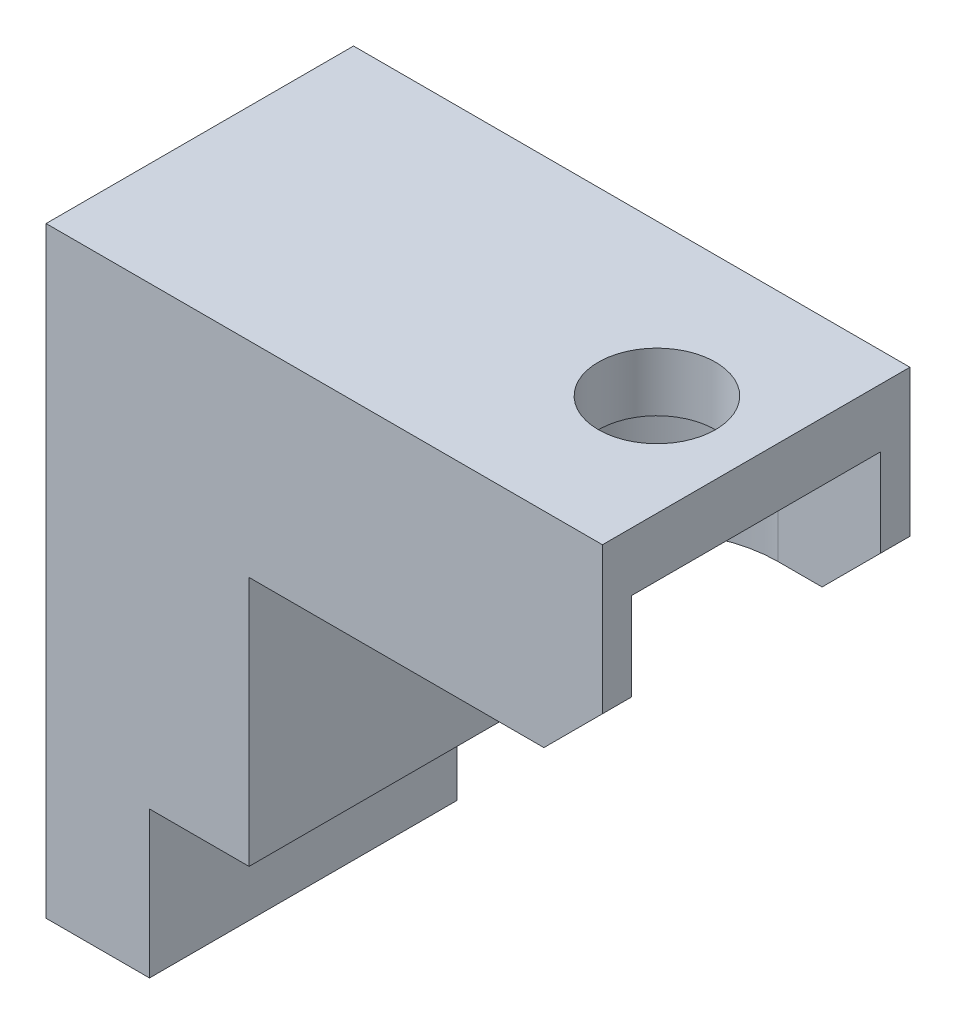
ISO-10303-21;
HEADER;
FILE_DESCRIPTION(('STEP AP214'),'2;1');
FILE_NAME('part.step','',(''),(''),'','','');
FILE_SCHEMA(('AUTOMOTIVE_DESIGN { 1 0 10303 214 1 1 1 1 }'));
ENDSEC;
DATA;
#1=APPLICATION_CONTEXT('core data for automotive mechanical design processes');
#2=APPLICATION_PROTOCOL_DEFINITION('international standard','automotive_design',2000,#1);
#3=PRODUCT_CONTEXT('',#1,'mechanical');
#4=PRODUCT('Part','Part','',(#3));
#5=PRODUCT_RELATED_PRODUCT_CATEGORY('part','',(#4));
#6=PRODUCT_DEFINITION_FORMATION('','',#4);
#7=PRODUCT_DEFINITION_CONTEXT('part definition',#1,'design');
#8=PRODUCT_DEFINITION('design','',#6,#7);
#9=PRODUCT_DEFINITION_SHAPE('','',#8);
#10=(LENGTH_UNIT() NAMED_UNIT(*) SI_UNIT(.MILLI.,.METRE.));
#11=(NAMED_UNIT(*) PLANE_ANGLE_UNIT() SI_UNIT($,.RADIAN.));
#12=(NAMED_UNIT(*) SI_UNIT($,.STERADIAN.) SOLID_ANGLE_UNIT());
#13=UNCERTAINTY_MEASURE_WITH_UNIT(LENGTH_MEASURE(1.E-05),#10,'distance_accuracy_value','');
#14=(GEOMETRIC_REPRESENTATION_CONTEXT(3) GLOBAL_UNCERTAINTY_ASSIGNED_CONTEXT((#13)) GLOBAL_UNIT_ASSIGNED_CONTEXT((#10,
#11,#12)) REPRESENTATION_CONTEXT('',''));
#15=CARTESIAN_POINT('',(0.,0.,0.));
#16=DIRECTION('',(0.,0.,1.));
#17=DIRECTION('',(1.,0.,0.));
#18=AXIS2_PLACEMENT_3D('',#15,#16,#17);
#19=CARTESIAN_POINT('',(-67.7875988190554,35.4526071642136,5.25));
#20=DIRECTION('',(-1.,0.,0.));
#21=DIRECTION('',(0.,-1.,0.));
#22=AXIS2_PLACEMENT_3D('',#19,#20,#21);
#23=PLANE('',#22);
#24=DIRECTION('',(0.,0.,-1.));
#25=VECTOR('',#24,1.);
#26=CARTESIAN_POINT('',(-67.7875988190554,44.,5.25));
#27=LINE('',#26,#25);
#28=CARTESIAN_POINT('',(-67.7875988190554,44.,5.25));
#29=VERTEX_POINT('',#28);
#30=CARTESIAN_POINT('',(-67.7875988190554,44.,-5.25));
#31=VERTEX_POINT('',#30);
#32=EDGE_CURVE('E166',#29,#31,#27,.T.);
#33=ORIENTED_EDGE('',*,*,#32,.F.);
#34=DIRECTION('',(0.,1.,0.));
#35=VECTOR('',#34,1.);
#36=CARTESIAN_POINT('',(-67.7875988190554,35.4526071642136,5.25));
#37=LINE('',#36,#35);
#38=CARTESIAN_POINT('',(-67.7875988190554,35.4526071642136,5.25));
#39=VERTEX_POINT('',#38);
#40=EDGE_CURVE('E187',#39,#29,#37,.T.);
#41=ORIENTED_EDGE('',*,*,#40,.F.);
#42=DIRECTION('',(0.,0.,-1.));
#43=VECTOR('',#42,1.);
#44=CARTESIAN_POINT('',(-67.7875988190554,35.4526071642136,5.25));
#45=LINE('',#44,#43);
#46=CARTESIAN_POINT('',(-67.7875988190554,35.4526071642136,-5.25));
#47=VERTEX_POINT('',#46);
#48=EDGE_CURVE('E218',#39,#47,#45,.T.);
#49=ORIENTED_EDGE('',*,*,#48,.T.);
#50=DIRECTION('',(0.,1.,0.));
#51=VECTOR('',#50,1.);
#52=CARTESIAN_POINT('',(-67.7875988190554,35.4526071642136,-5.25));
#53=LINE('',#52,#51);
#54=EDGE_CURVE('E172',#47,#31,#53,.T.);
#55=ORIENTED_EDGE('',*,*,#54,.T.);
#56=EDGE_LOOP('',(#33,#41,#49,#55));
#57=FACE_BOUND('',#56,.T.);
#58=ADVANCED_FACE('F32',(#57),#23,.F.);
#59=CARTESIAN_POINT('',(-55.7192964690554,49.,5.25));
#60=DIRECTION('',(0.,1.,0.));
#61=DIRECTION('',(0.,0.,1.));
#62=AXIS2_PLACEMENT_3D('',#59,#60,#61);
#63=PLANE('',#62);
#64=CARTESIAN_POINT('',(-59.1908650460189,49.,-0.081564640803819));
#65=DIRECTION('',(0.,1.,0.));
#66=DIRECTION('',(0.,0.,1.));
#67=AXIS2_PLACEMENT_3D('',#64,#65,#66);
#68=CIRCLE('',#67,2.);
#69=CARTESIAN_POINT('',(-59.1908650460189,49.,1.91843535919618));
#70=VERTEX_POINT('',#69);
#71=EDGE_CURVE('E282',#70,#70,#68,.F.);
#72=ORIENTED_EDGE('',*,*,#71,.F.);
#73=EDGE_LOOP('',(#72));
#74=FACE_BOUND('',#73,.T.);
#75=DIRECTION('',(-1.,0.,0.));
#76=VECTOR('',#75,1.);
#77=CARTESIAN_POINT('',(-55.7192964690554,49.,-4.25));
#78=LINE('',#77,#76);
#79=CARTESIAN_POINT('',(-55.7192964690554,49.,-4.25));
#80=VERTEX_POINT('',#79);
#81=CARTESIAN_POINT('',(-59.2192964690554,49.,-4.25));
#82=VERTEX_POINT('',#81);
#83=EDGE_CURVE('E148',#80,#82,#78,.T.);
#84=ORIENTED_EDGE('',*,*,#83,.F.);
#85=DIRECTION('',(0.,0.,-1.));
#86=VECTOR('',#85,1.);
#87=CARTESIAN_POINT('',(-55.7192964690554,49.,5.25));
#88=LINE('',#87,#86);
#89=CARTESIAN_POINT('',(-55.7192964690554,49.,4.25));
#90=VERTEX_POINT('',#89);
#91=EDGE_CURVE('E215',#90,#80,#88,.T.);
#92=ORIENTED_EDGE('',*,*,#91,.F.);
#93=DIRECTION('',(1.,0.,0.));
#94=VECTOR('',#93,1.);
#95=CARTESIAN_POINT('',(-55.7192964690554,49.,4.25));
#96=LINE('',#95,#94);
#97=CARTESIAN_POINT('',(-59.2192964690554,49.,4.25));
#98=VERTEX_POINT('',#97);
#99=EDGE_CURVE('E275',#98,#90,#96,.T.);
#100=ORIENTED_EDGE('',*,*,#99,.F.);
#101=CARTESIAN_POINT('',(-59.2192964690554,49.,0.));
#102=DIRECTION('',(0.,1.,0.));
#103=DIRECTION('',(0.,0.,1.));
#104=AXIS2_PLACEMENT_3D('',#101,#102,#103);
#105=CIRCLE('',#104,4.25);
#106=EDGE_CURVE('E279',#82,#98,#105,.T.);
#107=ORIENTED_EDGE('',*,*,#106,.F.);
#108=EDGE_LOOP('',(#84,#92,#100,#107));
#109=FACE_BOUND('',#108,.T.);
#110=ADVANCED_FACE('F300',(#74,#109),#63,.F.);
#111=CARTESIAN_POINT('',(-71.1875988190554,35.4526071642136,5.25));
#112=DIRECTION('',(0.,1.,0.));
#113=DIRECTION('',(0.,0.,1.));
#114=AXIS2_PLACEMENT_3D('',#111,#112,#113);
#115=PLANE('',#114);
#116=DIRECTION('',(1.,0.,0.));
#117=VECTOR('',#116,1.);
#118=CARTESIAN_POINT('',(-71.1875988190554,35.4526071642136,-5.25));
#119=LINE('',#118,#117);
#120=CARTESIAN_POINT('',(-71.1875988190554,35.4526071642136,-5.25));
#121=VERTEX_POINT('',#120);
#122=EDGE_CURVE('E169',#121,#47,#119,.T.);
#123=ORIENTED_EDGE('',*,*,#122,.T.);
#124=ORIENTED_EDGE('',*,*,#48,.F.);
#125=DIRECTION('',(1.,0.,0.));
#126=VECTOR('',#125,1.);
#127=CARTESIAN_POINT('',(-71.1875988190554,35.4526071642136,5.25));
#128=LINE('',#127,#126);
#129=CARTESIAN_POINT('',(-71.1875988190554,35.4526071642136,5.25));
#130=VERTEX_POINT('',#129);
#131=EDGE_CURVE('E184',#130,#39,#128,.T.);
#132=ORIENTED_EDGE('',*,*,#131,.F.);
#133=DIRECTION('',(0.,0.,-1.));
#134=VECTOR('',#133,1.);
#135=CARTESIAN_POINT('',(-71.1875988190554,35.4526071642136,5.25));
#136=LINE('',#135,#134);
#137=EDGE_CURVE('E200',#130,#121,#136,.T.);
#138=ORIENTED_EDGE('',*,*,#137,.T.);
#139=EDGE_LOOP('',(#123,#124,#132,#138));
#140=FACE_BOUND('',#139,.T.);
#141=ADVANCED_FACE('F34',(#140),#115,.F.);
#142=CARTESIAN_POINT('',(-55.7192964690554,51.,5.25));
#143=DIRECTION('',(-1.,0.,0.));
#144=DIRECTION('',(0.,0.,1.));
#145=AXIS2_PLACEMENT_3D('',#142,#143,#144);
#146=PLANE('',#145);
#147=DIRECTION('',(0.,1.,0.));
#148=VECTOR('',#147,1.);
#149=CARTESIAN_POINT('',(-55.7192964690554,51.,5.25));
#150=LINE('',#149,#148);
#151=CARTESIAN_POINT('',(-55.7192964690554,46.,5.25));
#152=VERTEX_POINT('',#151);
#153=CARTESIAN_POINT('',(-55.7192964690554,51.,5.25));
#154=VERTEX_POINT('',#153);
#155=EDGE_CURVE('E190',#152,#154,#150,.T.);
#156=ORIENTED_EDGE('',*,*,#155,.F.);
#157=DIRECTION('',(0.,0.,-1.));
#158=VECTOR('',#157,1.);
#159=CARTESIAN_POINT('',(-55.7192964690554,46.,5.25));
#160=LINE('',#159,#158);
#161=CARTESIAN_POINT('',(-55.7192964690554,46.,4.25));
#162=VERTEX_POINT('',#161);
#163=EDGE_CURVE('E54',#152,#162,#160,.T.);
#164=ORIENTED_EDGE('',*,*,#163,.T.);
#165=DIRECTION('',(0.,1.,0.));
#166=VECTOR('',#165,1.);
#167=CARTESIAN_POINT('',(-55.7192964690554,44.,4.25));
#168=LINE('',#167,#166);
#169=EDGE_CURVE('E159',#162,#90,#168,.T.);
#170=ORIENTED_EDGE('',*,*,#169,.T.);
#171=ORIENTED_EDGE('',*,*,#91,.T.);
#172=DIRECTION('',(0.,1.,0.));
#173=VECTOR('',#172,1.);
#174=CARTESIAN_POINT('',(-55.7192964690554,44.,-4.25));
#175=LINE('',#174,#173);
#176=CARTESIAN_POINT('',(-55.7192964690554,46.,-4.25));
#177=VERTEX_POINT('',#176);
#178=EDGE_CURVE('E151',#177,#80,#175,.T.);
#179=ORIENTED_EDGE('',*,*,#178,.F.);
#180=DIRECTION('',(0.,0.,-1.));
#181=VECTOR('',#180,1.);
#182=CARTESIAN_POINT('',(-55.7192964690554,46.,5.25));
#183=LINE('',#182,#181);
#184=CARTESIAN_POINT('',(-55.7192964690554,46.,-5.25));
#185=VERTEX_POINT('',#184);
#186=EDGE_CURVE('E227',#177,#185,#183,.T.);
#187=ORIENTED_EDGE('',*,*,#186,.T.);
#188=DIRECTION('',(0.,1.,0.));
#189=VECTOR('',#188,1.);
#190=CARTESIAN_POINT('',(-55.7192964690554,51.,-5.25));
#191=LINE('',#190,#189);
#192=CARTESIAN_POINT('',(-55.7192964690554,51.,-5.25));
#193=VERTEX_POINT('',#192);
#194=EDGE_CURVE('E174',#185,#193,#191,.T.);
#195=ORIENTED_EDGE('',*,*,#194,.T.);
#196=DIRECTION('',(0.,0.,-1.));
#197=VECTOR('',#196,1.);
#198=CARTESIAN_POINT('',(-55.7192964690554,51.,5.25));
#199=LINE('',#198,#197);
#200=EDGE_CURVE('E212',#154,#193,#199,.T.);
#201=ORIENTED_EDGE('',*,*,#200,.F.);
#202=EDGE_LOOP('',(#156,#164,#170,#171,#179,#187,#195,#201));
#203=FACE_BOUND('',#202,.T.);
#204=ADVANCED_FACE('F243',(#203),#146,.F.);
#205=CARTESIAN_POINT('',(-55.7192964690554,51.,5.25));
#206=DIRECTION('',(0.,-1.,0.));
#207=DIRECTION('',(0.,0.,-1.));
#208=AXIS2_PLACEMENT_3D('',#205,#206,#207);
#209=PLANE('',#208);
#210=CARTESIAN_POINT('',(-59.1908650460189,51.,-0.081564640803819));
#211=DIRECTION('',(0.,1.,0.));
#212=DIRECTION('',(0.,0.,1.));
#213=AXIS2_PLACEMENT_3D('',#210,#211,#212);
#214=CIRCLE('',#213,2.);
#215=CARTESIAN_POINT('',(-59.1908650460189,51.,1.91843535919618));
#216=VERTEX_POINT('',#215);
#217=EDGE_CURVE('E285',#216,#216,#214,.T.);
#218=ORIENTED_EDGE('',*,*,#217,.F.);
#219=EDGE_LOOP('',(#218));
#220=FACE_BOUND('',#219,.T.);
#221=DIRECTION('',(-1.,0.,0.));
#222=VECTOR('',#221,1.);
#223=CARTESIAN_POINT('',(-55.7192964690554,51.,-5.25));
#224=LINE('',#223,#222);
#225=CARTESIAN_POINT('',(-74.7192964690554,51.,-5.25));
#226=VERTEX_POINT('',#225);
#227=EDGE_CURVE('E176',#193,#226,#224,.T.);
#228=ORIENTED_EDGE('',*,*,#227,.T.);
#229=DIRECTION('',(0.,0.,-1.));
#230=VECTOR('',#229,1.);
#231=CARTESIAN_POINT('',(-74.7192964690554,51.,5.25));
#232=LINE('',#231,#230);
#233=CARTESIAN_POINT('',(-74.7192964690554,51.,5.25));
#234=VERTEX_POINT('',#233);
#235=EDGE_CURVE('E209',#234,#226,#232,.T.);
#236=ORIENTED_EDGE('',*,*,#235,.F.);
#237=DIRECTION('',(-1.,0.,0.));
#238=VECTOR('',#237,1.);
#239=CARTESIAN_POINT('',(-55.7192964690554,51.,5.25));
#240=LINE('',#239,#238);
#241=EDGE_CURVE('E192',#154,#234,#240,.T.);
#242=ORIENTED_EDGE('',*,*,#241,.F.);
#243=ORIENTED_EDGE('',*,*,#200,.T.);
#244=EDGE_LOOP('',(#228,#236,#242,#243));
#245=FACE_BOUND('',#244,.T.);
#246=ADVANCED_FACE('F249',(#220,#245),#209,.F.);
#247=CARTESIAN_POINT('',(-74.7192964690554,51.,5.25));
#248=DIRECTION('',(1.,0.,0.));
#249=DIRECTION('',(0.,0.,-1.));
#250=AXIS2_PLACEMENT_3D('',#247,#248,#249);
#251=PLANE('',#250);
#252=DIRECTION('',(0.,-1.,0.));
#253=VECTOR('',#252,1.);
#254=CARTESIAN_POINT('',(-74.7192964690554,51.,-5.25));
#255=LINE('',#254,#253);
#256=CARTESIAN_POINT('',(-74.7192964690554,30.4526071642136,-5.25));
#257=VERTEX_POINT('',#256);
#258=EDGE_CURVE('E178',#226,#257,#255,.T.);
#259=ORIENTED_EDGE('',*,*,#258,.T.);
#260=DIRECTION('',(0.,0.,-1.));
#261=VECTOR('',#260,1.);
#262=CARTESIAN_POINT('',(-74.7192964690554,30.4526071642136,5.25));
#263=LINE('',#262,#261);
#264=CARTESIAN_POINT('',(-74.7192964690554,30.4526071642136,5.25));
#265=VERTEX_POINT('',#264);
#266=EDGE_CURVE('E206',#265,#257,#263,.T.);
#267=ORIENTED_EDGE('',*,*,#266,.F.);
#268=DIRECTION('',(0.,-1.,0.));
#269=VECTOR('',#268,1.);
#270=CARTESIAN_POINT('',(-74.7192964690554,51.,5.25));
#271=LINE('',#270,#269);
#272=EDGE_CURVE('E194',#234,#265,#271,.T.);
#273=ORIENTED_EDGE('',*,*,#272,.F.);
#274=ORIENTED_EDGE('',*,*,#235,.T.);
#275=EDGE_LOOP('',(#259,#267,#273,#274));
#276=FACE_BOUND('',#275,.T.);
#277=ADVANCED_FACE('F255',(#276),#251,.F.);
#278=CARTESIAN_POINT('',(-71.1875988190554,30.4526071642136,5.25));
#279=DIRECTION('',(0.,1.,0.));
#280=DIRECTION('',(0.,0.,1.));
#281=AXIS2_PLACEMENT_3D('',#278,#279,#280);
#282=PLANE('',#281);
#283=DIRECTION('',(1.,0.,0.));
#284=VECTOR('',#283,1.);
#285=CARTESIAN_POINT('',(-71.1875988190554,30.4526071642136,-5.25));
#286=LINE('',#285,#284);
#287=CARTESIAN_POINT('',(-71.1875988190554,30.4526071642136,-5.25));
#288=VERTEX_POINT('',#287);
#289=EDGE_CURVE('E180',#257,#288,#286,.T.);
#290=ORIENTED_EDGE('',*,*,#289,.T.);
#291=DIRECTION('',(0.,0.,-1.));
#292=VECTOR('',#291,1.);
#293=CARTESIAN_POINT('',(-71.1875988190554,30.4526071642136,5.25));
#294=LINE('',#293,#292);
#295=CARTESIAN_POINT('',(-71.1875988190554,30.4526071642136,5.25));
#296=VERTEX_POINT('',#295);
#297=EDGE_CURVE('E203',#296,#288,#294,.T.);
#298=ORIENTED_EDGE('',*,*,#297,.F.);
#299=DIRECTION('',(1.,0.,0.));
#300=VECTOR('',#299,1.);
#301=CARTESIAN_POINT('',(-71.1875988190554,30.4526071642136,5.25));
#302=LINE('',#301,#300);
#303=EDGE_CURVE('E196',#265,#296,#302,.T.);
#304=ORIENTED_EDGE('',*,*,#303,.F.);
#305=ORIENTED_EDGE('',*,*,#266,.T.);
#306=EDGE_LOOP('',(#290,#298,#304,#305));
#307=FACE_BOUND('',#306,.T.);
#308=ADVANCED_FACE('F259',(#307),#282,.F.);
#309=CARTESIAN_POINT('',(-71.1875988190554,35.4526071642136,5.25));
#310=DIRECTION('',(-1.,0.,0.));
#311=DIRECTION('',(0.,0.,1.));
#312=AXIS2_PLACEMENT_3D('',#309,#310,#311);
#313=PLANE('',#312);
#314=DIRECTION('',(0.,1.,0.));
#315=VECTOR('',#314,1.);
#316=CARTESIAN_POINT('',(-71.1875988190554,35.4526071642136,-5.25));
#317=LINE('',#316,#315);
#318=EDGE_CURVE('E182',#288,#121,#317,.T.);
#319=ORIENTED_EDGE('',*,*,#318,.T.);
#320=ORIENTED_EDGE('',*,*,#137,.F.);
#321=DIRECTION('',(0.,1.,0.));
#322=VECTOR('',#321,1.);
#323=CARTESIAN_POINT('',(-71.1875988190554,35.4526071642136,5.25));
#324=LINE('',#323,#322);
#325=EDGE_CURVE('E198',#296,#130,#324,.T.);
#326=ORIENTED_EDGE('',*,*,#325,.F.);
#327=ORIENTED_EDGE('',*,*,#297,.T.);
#328=EDGE_LOOP('',(#319,#320,#326,#327));
#329=FACE_BOUND('',#328,.T.);
#330=ADVANCED_FACE('F264',(#329),#313,.F.);
#331=CARTESIAN_POINT('',(-55.7192964690554,35.4526071642136,5.25));
#332=DIRECTION('',(0.,0.,-1.));
#333=DIRECTION('',(-1.,0.,0.));
#334=AXIS2_PLACEMENT_3D('',#331,#332,#333);
#335=PLANE('',#334);
#336=DIRECTION('',(-1.,0.,0.));
#337=VECTOR('',#336,1.);
#338=CARTESIAN_POINT('',(-55.7192964690554,44.,5.25));
#339=LINE('',#338,#337);
#340=CARTESIAN_POINT('',(-57.7192964690554,44.,5.25));
#341=VERTEX_POINT('',#340);
#342=EDGE_CURVE('E242',#341,#29,#339,.T.);
#343=ORIENTED_EDGE('',*,*,#342,.F.);
#344=DIRECTION('',(-0.707106781186546,-0.707106781186549,0.));
#345=VECTOR('',#344,1.);
#346=CARTESIAN_POINT('',(-57.7192964690554,44.,5.25));
#347=LINE('',#346,#345);
#348=EDGE_CURVE('E225',#341,#152,#347,.F.);
#349=ORIENTED_EDGE('',*,*,#348,.T.);
#350=ORIENTED_EDGE('',*,*,#155,.T.);
#351=ORIENTED_EDGE('',*,*,#241,.T.);
#352=ORIENTED_EDGE('',*,*,#272,.T.);
#353=ORIENTED_EDGE('',*,*,#303,.T.);
#354=ORIENTED_EDGE('',*,*,#325,.T.);
#355=ORIENTED_EDGE('',*,*,#131,.T.);
#356=ORIENTED_EDGE('',*,*,#40,.T.);
#357=EDGE_LOOP('',(#343,#349,#350,#351,#352,#353,#354,#355,#356));
#358=FACE_BOUND('',#357,.T.);
#359=ADVANCED_FACE('F240',(#358),#335,.F.);
#360=CARTESIAN_POINT('',(-55.7192964690554,35.4526071642136,-5.25));
#361=DIRECTION('',(0.,0.,-1.));
#362=DIRECTION('',(-1.,0.,0.));
#363=AXIS2_PLACEMENT_3D('',#360,#361,#362);
#364=PLANE('',#363);
#365=ORIENTED_EDGE('',*,*,#194,.F.);
#366=DIRECTION('',(0.707106781186546,0.707106781186549,0.));
#367=VECTOR('',#366,1.);
#368=CARTESIAN_POINT('',(-60.9929928869486,40.7263035821068,-5.25));
#369=LINE('',#368,#367);
#370=CARTESIAN_POINT('',(-57.7192964690554,44.,-5.25));
#371=VERTEX_POINT('',#370);
#372=EDGE_CURVE('E11',#185,#371,#369,.F.);
#373=ORIENTED_EDGE('',*,*,#372,.T.);
#374=DIRECTION('',(1.,0.,0.));
#375=VECTOR('',#374,1.);
#376=CARTESIAN_POINT('',(-55.7192964690554,44.,-5.25));
#377=LINE('',#376,#375);
#378=EDGE_CURVE('E141',#31,#371,#377,.T.);
#379=ORIENTED_EDGE('',*,*,#378,.F.);
#380=ORIENTED_EDGE('',*,*,#54,.F.);
#381=ORIENTED_EDGE('',*,*,#122,.F.);
#382=ORIENTED_EDGE('',*,*,#318,.F.);
#383=ORIENTED_EDGE('',*,*,#289,.F.);
#384=ORIENTED_EDGE('',*,*,#258,.F.);
#385=ORIENTED_EDGE('',*,*,#227,.F.);
#386=EDGE_LOOP('',(#365,#373,#379,#380,#381,#382,#383,#384,#385));
#387=FACE_BOUND('',#386,.T.);
#388=ADVANCED_FACE('F273',(#387),#364,.T.);
#389=CARTESIAN_POINT('',(-59.2192964690554,44.,0.));
#390=DIRECTION('',(0.,1.,0.));
#391=DIRECTION('',(0.,0.,1.));
#392=AXIS2_PLACEMENT_3D('',#389,#390,#391);
#393=PLANE('',#392);
#394=DIRECTION('',(1.,0.,0.));
#395=VECTOR('',#394,1.);
#396=CARTESIAN_POINT('',(-55.7192964690554,44.,4.25));
#397=LINE('',#396,#395);
#398=CARTESIAN_POINT('',(-59.2192964690554,44.,4.25));
#399=VERTEX_POINT('',#398);
#400=CARTESIAN_POINT('',(-57.7192964690554,44.,4.25));
#401=VERTEX_POINT('',#400);
#402=EDGE_CURVE('E157',#399,#401,#397,.T.);
#403=ORIENTED_EDGE('',*,*,#402,.T.);
#404=DIRECTION('',(0.,0.,1.));
#405=VECTOR('',#404,1.);
#406=CARTESIAN_POINT('',(-57.7192964690554,44.,0.));
#407=LINE('',#406,#405);
#408=EDGE_CURVE('E222',#401,#341,#407,.T.);
#409=ORIENTED_EDGE('',*,*,#408,.T.);
#410=ORIENTED_EDGE('',*,*,#342,.T.);
#411=ORIENTED_EDGE('',*,*,#32,.T.);
#412=ORIENTED_EDGE('',*,*,#378,.T.);
#413=DIRECTION('',(0.,0.,1.));
#414=VECTOR('',#413,1.);
#415=CARTESIAN_POINT('',(-57.7192964690554,44.,0.));
#416=LINE('',#415,#414);
#417=CARTESIAN_POINT('',(-57.7192964690554,44.,-4.25));
#418=VERTEX_POINT('',#417);
#419=EDGE_CURVE('E140',#371,#418,#416,.T.);
#420=ORIENTED_EDGE('',*,*,#419,.T.);
#421=DIRECTION('',(-1.,0.,0.));
#422=VECTOR('',#421,1.);
#423=CARTESIAN_POINT('',(-55.7192964690554,44.,-4.25));
#424=LINE('',#423,#422);
#425=CARTESIAN_POINT('',(-59.2192964690554,44.,-4.25));
#426=VERTEX_POINT('',#425);
#427=EDGE_CURVE('E131',#418,#426,#424,.T.);
#428=ORIENTED_EDGE('',*,*,#427,.T.);
#429=CARTESIAN_POINT('',(-59.2192964690554,44.,0.));
#430=DIRECTION('',(0.,1.,0.));
#431=DIRECTION('',(0.,0.,1.));
#432=AXIS2_PLACEMENT_3D('',#429,#430,#431);
#433=CIRCLE('',#432,4.25);
#434=EDGE_CURVE('E136',#426,#399,#433,.T.);
#435=ORIENTED_EDGE('',*,*,#434,.T.);
#436=EDGE_LOOP('',(#403,#409,#410,#411,#412,#420,#428,#435));
#437=FACE_BOUND('',#436,.T.);
#438=ADVANCED_FACE('F134',(#437),#393,.F.);
#439=CARTESIAN_POINT('',(-55.7192964690554,44.,-4.25));
#440=DIRECTION('',(0.,0.,-1.));
#441=DIRECTION('',(-1.,0.,0.));
#442=AXIS2_PLACEMENT_3D('',#439,#440,#441);
#443=PLANE('',#442);
#444=ORIENTED_EDGE('',*,*,#427,.F.);
#445=DIRECTION('',(-0.707106781186546,-0.707106781186549,0.));
#446=VECTOR('',#445,1.);
#447=CARTESIAN_POINT('',(-57.7192964690554,44.,-4.25));
#448=LINE('',#447,#446);
#449=EDGE_CURVE('E40',#418,#177,#448,.F.);
#450=ORIENTED_EDGE('',*,*,#449,.T.);
#451=ORIENTED_EDGE('',*,*,#178,.T.);
#452=ORIENTED_EDGE('',*,*,#83,.T.);
#453=DIRECTION('',(0.,1.,0.));
#454=VECTOR('',#453,1.);
#455=CARTESIAN_POINT('',(-59.2192964690554,44.,-4.25));
#456=LINE('',#455,#454);
#457=EDGE_CURVE('E145',#426,#82,#456,.T.);
#458=ORIENTED_EDGE('',*,*,#457,.F.);
#459=EDGE_LOOP('',(#444,#450,#451,#452,#458));
#460=FACE_BOUND('',#459,.T.);
#461=ADVANCED_FACE('F146',(#460),#443,.F.);
#462=CARTESIAN_POINT('',(-59.2192964690554,44.,0.));
#463=DIRECTION('',(0.,1.,0.));
#464=DIRECTION('',(0.,0.,1.));
#465=AXIS2_PLACEMENT_3D('',#462,#463,#464);
#466=CYLINDRICAL_SURFACE('',#465,4.25);
#467=ORIENTED_EDGE('',*,*,#106,.T.);
#468=DIRECTION('',(0.,1.,0.));
#469=VECTOR('',#468,1.);
#470=CARTESIAN_POINT('',(-59.2192964690554,44.,4.25));
#471=LINE('',#470,#469);
#472=EDGE_CURVE('E152',#399,#98,#471,.T.);
#473=ORIENTED_EDGE('',*,*,#472,.F.);
#474=ORIENTED_EDGE('',*,*,#434,.F.);
#475=ORIENTED_EDGE('',*,*,#457,.T.);
#476=EDGE_LOOP('',(#467,#473,#474,#475));
#477=FACE_BOUND('',#476,.T.);
#478=ADVANCED_FACE('F154',(#477),#466,.F.);
#479=CARTESIAN_POINT('',(-55.7192964690554,44.,4.25));
#480=DIRECTION('',(0.,0.,1.));
#481=DIRECTION('',(1.,0.,0.));
#482=AXIS2_PLACEMENT_3D('',#479,#480,#481);
#483=PLANE('',#482);
#484=ORIENTED_EDGE('',*,*,#169,.F.);
#485=DIRECTION('',(0.707106781186546,0.707106781186549,0.));
#486=VECTOR('',#485,1.);
#487=CARTESIAN_POINT('',(-57.7192964690554,44.,4.25));
#488=LINE('',#487,#486);
#489=EDGE_CURVE('E230',#162,#401,#488,.F.);
#490=ORIENTED_EDGE('',*,*,#489,.T.);
#491=ORIENTED_EDGE('',*,*,#402,.F.);
#492=ORIENTED_EDGE('',*,*,#472,.T.);
#493=ORIENTED_EDGE('',*,*,#99,.T.);
#494=EDGE_LOOP('',(#484,#490,#491,#492,#493));
#495=FACE_BOUND('',#494,.T.);
#496=ADVANCED_FACE('F233',(#495),#483,.F.);
#497=CARTESIAN_POINT('',(-59.1908650460189,43.3431457505076,-0.081564640803819));
#498=DIRECTION('',(0.,1.,0.));
#499=DIRECTION('',(0.,0.,1.));
#500=AXIS2_PLACEMENT_3D('',#497,#498,#499);
#501=CYLINDRICAL_SURFACE('',#500,2.);
#502=CARTESIAN_POINT('',(-59.1908650460189,49.,1.91843535919618));
#503=CARTESIAN_POINT('',(-59.1908650460189,49.0208333333333,1.91843535919618));
#504=CARTESIAN_POINT('',(-59.1908650460189,49.0416666666667,1.91843535919618));
#505=CARTESIAN_POINT('',(-59.1908650460189,49.0833333333333,1.91843535919618));
#506=CARTESIAN_POINT('',(-59.1908650460189,49.1041666666667,1.91843535919618));
#507=CARTESIAN_POINT('',(-59.1908650460189,49.1458333333333,1.91843535919618));
#508=CARTESIAN_POINT('',(-59.1908650460189,49.1666666666667,1.91843535919618));
#509=CARTESIAN_POINT('',(-59.1908650460189,49.2083333333333,1.91843535919618));
#510=CARTESIAN_POINT('',(-59.1908650460189,49.2291666666667,1.91843535919618));
#511=CARTESIAN_POINT('',(-59.1908650460189,49.2708333333333,1.91843535919618));
#512=CARTESIAN_POINT('',(-59.1908650460189,49.2916666666667,1.91843535919618));
#513=CARTESIAN_POINT('',(-59.1908650460189,49.3333333333333,1.91843535919618));
#514=CARTESIAN_POINT('',(-59.1908650460189,49.3541666666667,1.91843535919618));
#515=CARTESIAN_POINT('',(-59.1908650460189,49.3958333333333,1.91843535919618));
#516=CARTESIAN_POINT('',(-59.1908650460189,49.4166666666667,1.91843535919618));
#517=CARTESIAN_POINT('',(-59.1908650460189,49.4583333333333,1.91843535919618));
#518=CARTESIAN_POINT('',(-59.1908650460189,49.4791666666667,1.91843535919618));
#519=CARTESIAN_POINT('',(-59.1908650460189,49.5208333333333,1.91843535919618));
#520=CARTESIAN_POINT('',(-59.1908650460189,49.5416666666667,1.91843535919618));
#521=CARTESIAN_POINT('',(-59.1908650460189,49.5833333333333,1.91843535919618));
#522=CARTESIAN_POINT('',(-59.1908650460189,49.6041666666667,1.91843535919618));
#523=CARTESIAN_POINT('',(-59.1908650460189,49.6458333333333,1.91843535919618));
#524=CARTESIAN_POINT('',(-59.1908650460189,49.6666666666667,1.91843535919618));
#525=CARTESIAN_POINT('',(-59.1908650460189,49.7083333333333,1.91843535919618));
#526=CARTESIAN_POINT('',(-59.1908650460189,49.7291666666667,1.91843535919618));
#527=CARTESIAN_POINT('',(-59.1908650460189,49.7708333333333,1.91843535919618));
#528=CARTESIAN_POINT('',(-59.1908650460189,49.7916666666667,1.91843535919618));
#529=CARTESIAN_POINT('',(-59.1908650460189,49.8333333333333,1.91843535919618));
#530=CARTESIAN_POINT('',(-59.1908650460189,49.8541666666667,1.91843535919618));
#531=CARTESIAN_POINT('',(-59.1908650460189,49.8958333333333,1.91843535919618));
#532=CARTESIAN_POINT('',(-59.1908650460189,49.9166666666667,1.91843535919618));
#533=CARTESIAN_POINT('',(-59.1908650460189,49.9583333333333,1.91843535919618));
#534=CARTESIAN_POINT('',(-59.1908650460189,49.9791666666667,1.91843535919618));
#535=CARTESIAN_POINT('',(-59.1908650460189,50.0208333333333,1.91843535919618));
#536=CARTESIAN_POINT('',(-59.1908650460189,50.0416666666667,1.91843535919618));
#537=CARTESIAN_POINT('',(-59.1908650460189,50.0833333333333,1.91843535919618));
#538=CARTESIAN_POINT('',(-59.1908650460189,50.1041666666667,1.91843535919618));
#539=CARTESIAN_POINT('',(-59.1908650460189,50.1458333333333,1.91843535919618));
#540=CARTESIAN_POINT('',(-59.1908650460189,50.1666666666667,1.91843535919618));
#541=CARTESIAN_POINT('',(-59.1908650460189,50.2083333333333,1.91843535919618));
#542=CARTESIAN_POINT('',(-59.1908650460189,50.2291666666667,1.91843535919618));
#543=CARTESIAN_POINT('',(-59.1908650460189,50.2708333333333,1.91843535919618));
#544=CARTESIAN_POINT('',(-59.1908650460189,50.2916666666667,1.91843535919618));
#545=CARTESIAN_POINT('',(-59.1908650460189,50.3333333333333,1.91843535919618));
#546=CARTESIAN_POINT('',(-59.1908650460189,50.3541666666667,1.91843535919618));
#547=CARTESIAN_POINT('',(-59.1908650460189,50.3958333333333,1.91843535919618));
#548=CARTESIAN_POINT('',(-59.1908650460189,50.4166666666667,1.91843535919618));
#549=CARTESIAN_POINT('',(-59.1908650460189,50.4583333333333,1.91843535919618));
#550=CARTESIAN_POINT('',(-59.1908650460189,50.4791666666667,1.91843535919618));
#551=CARTESIAN_POINT('',(-59.1908650460189,50.5208333333333,1.91843535919618));
#552=CARTESIAN_POINT('',(-59.1908650460189,50.5416666666667,1.91843535919618));
#553=CARTESIAN_POINT('',(-59.1908650460189,50.5833333333333,1.91843535919618));
#554=CARTESIAN_POINT('',(-59.1908650460189,50.6041666666667,1.91843535919618));
#555=CARTESIAN_POINT('',(-59.1908650460189,50.6458333333333,1.91843535919618));
#556=CARTESIAN_POINT('',(-59.1908650460189,50.6666666666667,1.91843535919618));
#557=CARTESIAN_POINT('',(-59.1908650460189,50.7083333333333,1.91843535919618));
#558=CARTESIAN_POINT('',(-59.1908650460189,50.7291666666667,1.91843535919618));
#559=CARTESIAN_POINT('',(-59.1908650460189,50.7708333333333,1.91843535919618));
#560=CARTESIAN_POINT('',(-59.1908650460189,50.7916666666667,1.91843535919618));
#561=CARTESIAN_POINT('',(-59.1908650460189,50.8333333333333,1.91843535919618));
#562=CARTESIAN_POINT('',(-59.1908650460189,50.8541666666667,1.91843535919618));
#563=CARTESIAN_POINT('',(-59.1908650460189,50.8958333333333,1.91843535919618));
#564=CARTESIAN_POINT('',(-59.1908650460189,50.9166666666667,1.91843535919618));
#565=CARTESIAN_POINT('',(-59.1908650460189,50.9583333333333,1.91843535919618));
#566=CARTESIAN_POINT('',(-59.1908650460189,50.9791666666667,1.91843535919618));
#567=CARTESIAN_POINT('',(-59.1908650460189,51.,1.91843535919618));
#568=B_SPLINE_CURVE_WITH_KNOTS('',3,(#502,#503,#504,#505,#506,#507,#508,#509,#510,#511,#512,
#513,#514,#515,#516,#517,#518,#519,#520,#521,#522,#523,#524,#525,#526,#527,#528,#529,#530,#531,
#532,#533,#534,#535,#536,#537,#538,#539,#540,#541,#542,#543,#544,#545,#546,#547,#548,#549,#550,
#551,#552,#553,#554,#555,#556,#557,#558,#559,#560,#561,#562,#563,#564,#565,#566,#567),
.UNSPECIFIED.,.F.,.F.,(4,2,2,2,2,2,2,2,2,2,2,2,2,2,2,2,2,2,2,2,2,2,2,2,2,2,2,2,2,2,2,2,4),(0.,
0.0625000000000001,0.125,0.1875,0.25,0.3125,0.375,0.4375,0.5,0.5625,0.625000000000001,
0.687500000000001,0.750000000000001,0.812500000000001,0.875000000000001,0.937500000000001,1.,
1.0625,1.125,1.1875,1.25,1.3125,1.375,1.4375,1.5,1.5625,1.625,1.6875,1.75,1.8125,1.875,1.9375,
2.),.UNSPECIFIED.);
#569=EDGE_CURVE('BSEAM289',#70,#216,#568,.T.);
#570=ORIENTED_EDGE('',*,*,#71,.T.);
#571=ORIENTED_EDGE('',*,*,#217,.T.);
#572=ORIENTED_EDGE('',*,*,#569,.T.);
#573=ORIENTED_EDGE('',*,*,#569,.F.);
#574=EDGE_LOOP('',(#570,#572,#571,#573));
#575=FACE_BOUND('',#574,.T.);
#576=ADVANCED_FACE('F289',(#575),#501,.F.);
#577=CARTESIAN_POINT('',(-57.7192964690554,44.,0.));
#578=DIRECTION('',(-0.707106781186549,0.707106781186546,0.));
#579=DIRECTION('',(-0.707106781186546,-0.707106781186549,0.));
#580=AXIS2_PLACEMENT_3D('',#577,#578,#579);
#581=PLANE('',#580);
#582=ORIENTED_EDGE('',*,*,#489,.F.);
#583=ORIENTED_EDGE('',*,*,#163,.F.);
#584=ORIENTED_EDGE('',*,*,#348,.F.);
#585=ORIENTED_EDGE('',*,*,#408,.F.);
#586=EDGE_LOOP('',(#582,#583,#584,#585));
#587=FACE_BOUND('',#586,.T.);
#588=ADVANCED_FACE('F238',(#587),#581,.F.);
#589=CARTESIAN_POINT('',(-57.7192964690554,44.,0.));
#590=DIRECTION('',(-0.707106781186549,0.707106781186546,0.));
#591=DIRECTION('',(-0.707106781186546,-0.707106781186549,0.));
#592=AXIS2_PLACEMENT_3D('',#589,#590,#591);
#593=PLANE('',#592);
#594=ORIENTED_EDGE('',*,*,#372,.F.);
#595=ORIENTED_EDGE('',*,*,#186,.F.);
#596=ORIENTED_EDGE('',*,*,#449,.F.);
#597=ORIENTED_EDGE('',*,*,#419,.F.);
#598=EDGE_LOOP('',(#594,#595,#596,#597));
#599=FACE_BOUND('',#598,.T.);
#600=ADVANCED_FACE('F314',(#599),#593,.F.);
#601=CLOSED_SHELL('',(#58,#110,#141,#204,#246,#277,#308,#330,#359,#388,#438,#461,#478,#496,#576,
#588,#600));
#602=MANIFOLD_SOLID_BREP('B2',#601);
#603=ADVANCED_BREP_SHAPE_REPRESENTATION('',(#18,#602),#14);
#604=SHAPE_DEFINITION_REPRESENTATION(#9,#603);
ENDSEC;
END-ISO-10303-21;
